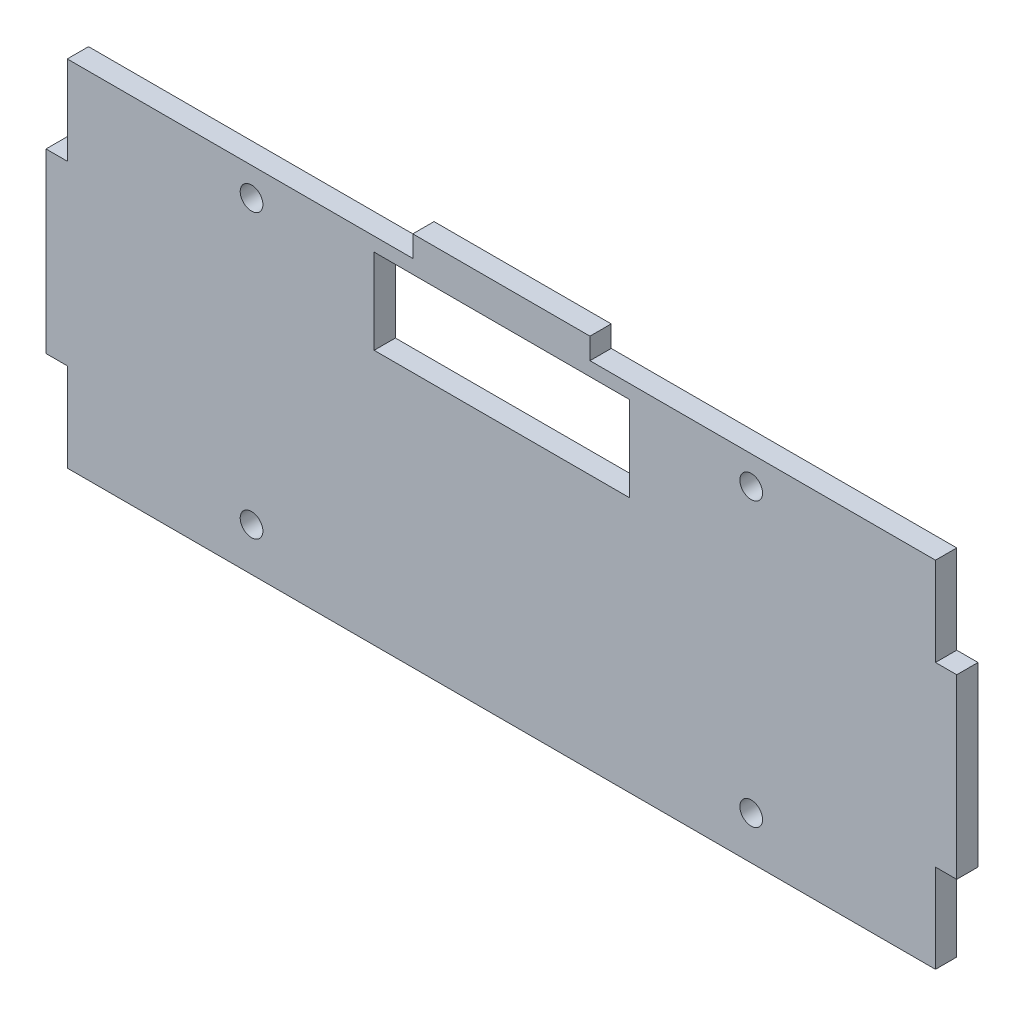
ISO-10303-21;
HEADER;
FILE_DESCRIPTION(('STEP AP214'),'2;1');
FILE_NAME('part.step','',(''),(''),'','','');
FILE_SCHEMA(('AUTOMOTIVE_DESIGN { 1 0 10303 214 1 1 1 1 }'));
ENDSEC;
DATA;
#1=APPLICATION_CONTEXT('core data for automotive mechanical design processes');
#2=APPLICATION_PROTOCOL_DEFINITION('international standard','automotive_design',2000,#1);
#3=PRODUCT_CONTEXT('',#1,'mechanical');
#4=PRODUCT('Part','Part','',(#3));
#5=PRODUCT_RELATED_PRODUCT_CATEGORY('part','',(#4));
#6=PRODUCT_DEFINITION_FORMATION('','',#4);
#7=PRODUCT_DEFINITION_CONTEXT('part definition',#1,'design');
#8=PRODUCT_DEFINITION('design','',#6,#7);
#9=PRODUCT_DEFINITION_SHAPE('','',#8);
#10=(LENGTH_UNIT() NAMED_UNIT(*) SI_UNIT(.MILLI.,.METRE.));
#11=(NAMED_UNIT(*) PLANE_ANGLE_UNIT() SI_UNIT($,.RADIAN.));
#12=(NAMED_UNIT(*) SI_UNIT($,.STERADIAN.) SOLID_ANGLE_UNIT());
#13=UNCERTAINTY_MEASURE_WITH_UNIT(LENGTH_MEASURE(1.E-05),#10,'distance_accuracy_value','');
#14=(GEOMETRIC_REPRESENTATION_CONTEXT(3) GLOBAL_UNCERTAINTY_ASSIGNED_CONTEXT((#13)) GLOBAL_UNIT_ASSIGNED_CONTEXT((#10,
#11,#12)) REPRESENTATION_CONTEXT('',''));
#15=CARTESIAN_POINT('',(0.,0.,0.));
#16=DIRECTION('',(0.,0.,1.));
#17=DIRECTION('',(1.,0.,0.));
#18=AXIS2_PLACEMENT_3D('',#15,#16,#17);
#19=CARTESIAN_POINT('',(-61.25,12.5,3.));
#20=DIRECTION('',(1.,0.,0.));
#21=DIRECTION('',(0.,0.,-1.));
#22=AXIS2_PLACEMENT_3D('',#19,#20,#21);
#23=PLANE('',#22);
#24=DIRECTION('',(0.,-1.,0.));
#25=VECTOR('',#24,1.);
#26=CARTESIAN_POINT('',(-61.25,12.5,0.));
#27=LINE('',#26,#25);
#28=CARTESIAN_POINT('',(-61.25,25.,0.));
#29=VERTEX_POINT('',#28);
#30=CARTESIAN_POINT('',(-61.25,12.5,0.));
#31=VERTEX_POINT('',#30);
#32=EDGE_CURVE('E206',#29,#31,#27,.T.);
#33=ORIENTED_EDGE('',*,*,#32,.T.);
#34=DIRECTION('',(0.,0.,-1.));
#35=VECTOR('',#34,1.);
#36=CARTESIAN_POINT('',(-61.25,12.5,3.));
#37=LINE('',#36,#35);
#38=CARTESIAN_POINT('',(-61.25,12.5,3.));
#39=VERTEX_POINT('',#38);
#40=EDGE_CURVE('E40',#39,#31,#37,.T.);
#41=ORIENTED_EDGE('',*,*,#40,.F.);
#42=DIRECTION('',(0.,-1.,0.));
#43=VECTOR('',#42,1.);
#44=CARTESIAN_POINT('',(-61.25,12.5,3.));
#45=LINE('',#44,#43);
#46=CARTESIAN_POINT('',(-61.25,25.,3.));
#47=VERTEX_POINT('',#46);
#48=EDGE_CURVE('E210',#47,#39,#45,.T.);
#49=ORIENTED_EDGE('',*,*,#48,.F.);
#50=DIRECTION('',(0.,0.,-1.));
#51=VECTOR('',#50,1.);
#52=CARTESIAN_POINT('',(-61.25,25.,3.));
#53=LINE('',#52,#51);
#54=EDGE_CURVE('E11',#47,#29,#53,.T.);
#55=ORIENTED_EDGE('',*,*,#54,.T.);
#56=EDGE_LOOP('',(#33,#41,#49,#55));
#57=FACE_BOUND('',#56,.T.);
#58=ADVANCED_FACE('F33',(#57),#23,.F.);
#59=CARTESIAN_POINT('',(-61.25,12.5,3.));
#60=DIRECTION('',(0.,-1.,0.));
#61=DIRECTION('',(1.,0.,0.));
#62=AXIS2_PLACEMENT_3D('',#59,#60,#61);
#63=PLANE('',#62);
#64=DIRECTION('',(-1.,0.,0.));
#65=VECTOR('',#64,1.);
#66=CARTESIAN_POINT('',(-61.25,12.5,0.));
#67=LINE('',#66,#65);
#68=CARTESIAN_POINT('',(-64.25,12.5,0.));
#69=VERTEX_POINT('',#68);
#70=EDGE_CURVE('E244',#31,#69,#67,.T.);
#71=ORIENTED_EDGE('',*,*,#70,.T.);
#72=DIRECTION('',(0.,0.,-1.));
#73=VECTOR('',#72,1.);
#74=CARTESIAN_POINT('',(-64.25,12.5,3.));
#75=LINE('',#74,#73);
#76=CARTESIAN_POINT('',(-64.25,12.5,3.));
#77=VERTEX_POINT('',#76);
#78=EDGE_CURVE('E313',#77,#69,#75,.T.);
#79=ORIENTED_EDGE('',*,*,#78,.F.);
#80=DIRECTION('',(-1.,0.,0.));
#81=VECTOR('',#80,1.);
#82=CARTESIAN_POINT('',(-61.25,12.5,3.));
#83=LINE('',#82,#81);
#84=EDGE_CURVE('E213',#39,#77,#83,.T.);
#85=ORIENTED_EDGE('',*,*,#84,.F.);
#86=ORIENTED_EDGE('',*,*,#40,.T.);
#87=EDGE_LOOP('',(#71,#79,#85,#86));
#88=FACE_BOUND('',#87,.T.);
#89=ADVANCED_FACE('F320',(#88),#63,.F.);
#90=CARTESIAN_POINT('',(-64.25,-12.5,3.));
#91=DIRECTION('',(1.,0.,0.));
#92=DIRECTION('',(0.,0.,-1.));
#93=AXIS2_PLACEMENT_3D('',#90,#91,#92);
#94=PLANE('',#93);
#95=DIRECTION('',(0.,-1.,0.));
#96=VECTOR('',#95,1.);
#97=CARTESIAN_POINT('',(-64.25,-12.5,0.));
#98=LINE('',#97,#96);
#99=CARTESIAN_POINT('',(-64.25,-12.5,0.));
#100=VERTEX_POINT('',#99);
#101=EDGE_CURVE('E246',#69,#100,#98,.T.);
#102=ORIENTED_EDGE('',*,*,#101,.T.);
#103=DIRECTION('',(0.,0.,-1.));
#104=VECTOR('',#103,1.);
#105=CARTESIAN_POINT('',(-64.25,-12.5,3.));
#106=LINE('',#105,#104);
#107=CARTESIAN_POINT('',(-64.25,-12.5,3.));
#108=VERTEX_POINT('',#107);
#109=EDGE_CURVE('E310',#108,#100,#106,.T.);
#110=ORIENTED_EDGE('',*,*,#109,.F.);
#111=DIRECTION('',(0.,-1.,0.));
#112=VECTOR('',#111,1.);
#113=CARTESIAN_POINT('',(-64.25,-12.5,3.));
#114=LINE('',#113,#112);
#115=EDGE_CURVE('E215',#77,#108,#114,.T.);
#116=ORIENTED_EDGE('',*,*,#115,.F.);
#117=ORIENTED_EDGE('',*,*,#78,.T.);
#118=EDGE_LOOP('',(#102,#110,#116,#117));
#119=FACE_BOUND('',#118,.T.);
#120=ADVANCED_FACE('F329',(#119),#94,.F.);
#121=CARTESIAN_POINT('',(-61.25,-12.5,3.));
#122=DIRECTION('',(0.,1.,0.));
#123=DIRECTION('',(0.,0.,1.));
#124=AXIS2_PLACEMENT_3D('',#121,#122,#123);
#125=PLANE('',#124);
#126=DIRECTION('',(1.,0.,0.));
#127=VECTOR('',#126,1.);
#128=CARTESIAN_POINT('',(-61.25,-12.5,0.));
#129=LINE('',#128,#127);
#130=CARTESIAN_POINT('',(-61.25,-12.5,0.));
#131=VERTEX_POINT('',#130);
#132=EDGE_CURVE('E248',#100,#131,#129,.T.);
#133=ORIENTED_EDGE('',*,*,#132,.T.);
#134=DIRECTION('',(0.,0.,-1.));
#135=VECTOR('',#134,1.);
#136=CARTESIAN_POINT('',(-61.25,-12.5,3.));
#137=LINE('',#136,#135);
#138=CARTESIAN_POINT('',(-61.25,-12.5,3.));
#139=VERTEX_POINT('',#138);
#140=EDGE_CURVE('E307',#139,#131,#137,.T.);
#141=ORIENTED_EDGE('',*,*,#140,.F.);
#142=DIRECTION('',(1.,0.,0.));
#143=VECTOR('',#142,1.);
#144=CARTESIAN_POINT('',(-61.25,-12.5,3.));
#145=LINE('',#144,#143);
#146=EDGE_CURVE('E217',#108,#139,#145,.T.);
#147=ORIENTED_EDGE('',*,*,#146,.F.);
#148=ORIENTED_EDGE('',*,*,#109,.T.);
#149=EDGE_LOOP('',(#133,#141,#147,#148));
#150=FACE_BOUND('',#149,.T.);
#151=ADVANCED_FACE('F333',(#150),#125,.F.);
#152=CARTESIAN_POINT('',(-61.25,-25.,3.));
#153=DIRECTION('',(1.,0.,0.));
#154=DIRECTION('',(0.,0.,-1.));
#155=AXIS2_PLACEMENT_3D('',#152,#153,#154);
#156=PLANE('',#155);
#157=DIRECTION('',(0.,-1.,0.));
#158=VECTOR('',#157,1.);
#159=CARTESIAN_POINT('',(-61.25,-25.,0.));
#160=LINE('',#159,#158);
#161=CARTESIAN_POINT('',(-61.25,-25.,0.));
#162=VERTEX_POINT('',#161);
#163=EDGE_CURVE('E250',#131,#162,#160,.T.);
#164=ORIENTED_EDGE('',*,*,#163,.T.);
#165=DIRECTION('',(0.,0.,-1.));
#166=VECTOR('',#165,1.);
#167=CARTESIAN_POINT('',(-61.25,-25.,3.));
#168=LINE('',#167,#166);
#169=CARTESIAN_POINT('',(-61.25,-25.,3.));
#170=VERTEX_POINT('',#169);
#171=EDGE_CURVE('E304',#170,#162,#168,.T.);
#172=ORIENTED_EDGE('',*,*,#171,.F.);
#173=DIRECTION('',(0.,-1.,0.));
#174=VECTOR('',#173,1.);
#175=CARTESIAN_POINT('',(-61.25,-25.,3.));
#176=LINE('',#175,#174);
#177=EDGE_CURVE('E219',#139,#170,#176,.T.);
#178=ORIENTED_EDGE('',*,*,#177,.F.);
#179=ORIENTED_EDGE('',*,*,#140,.T.);
#180=EDGE_LOOP('',(#164,#172,#178,#179));
#181=FACE_BOUND('',#180,.T.);
#182=ADVANCED_FACE('F392',(#181),#156,.F.);
#183=CARTESIAN_POINT('',(61.25,-25.,3.));
#184=DIRECTION('',(0.,1.,0.));
#185=DIRECTION('',(-1.,0.,0.));
#186=AXIS2_PLACEMENT_3D('',#183,#184,#185);
#187=PLANE('',#186);
#188=DIRECTION('',(1.,0.,0.));
#189=VECTOR('',#188,1.);
#190=CARTESIAN_POINT('',(61.25,-25.,0.));
#191=LINE('',#190,#189);
#192=CARTESIAN_POINT('',(61.25,-25.,0.));
#193=VERTEX_POINT('',#192);
#194=EDGE_CURVE('E252',#162,#193,#191,.T.);
#195=ORIENTED_EDGE('',*,*,#194,.T.);
#196=DIRECTION('',(0.,0.,-1.));
#197=VECTOR('',#196,1.);
#198=CARTESIAN_POINT('',(61.25,-25.,3.));
#199=LINE('',#198,#197);
#200=CARTESIAN_POINT('',(61.25,-25.,3.));
#201=VERTEX_POINT('',#200);
#202=EDGE_CURVE('E301',#201,#193,#199,.T.);
#203=ORIENTED_EDGE('',*,*,#202,.F.);
#204=DIRECTION('',(1.,0.,0.));
#205=VECTOR('',#204,1.);
#206=CARTESIAN_POINT('',(61.25,-25.,3.));
#207=LINE('',#206,#205);
#208=EDGE_CURVE('E221',#170,#201,#207,.T.);
#209=ORIENTED_EDGE('',*,*,#208,.F.);
#210=ORIENTED_EDGE('',*,*,#171,.T.);
#211=EDGE_LOOP('',(#195,#203,#209,#210));
#212=FACE_BOUND('',#211,.T.);
#213=ADVANCED_FACE('F390',(#212),#187,.F.);
#214=CARTESIAN_POINT('',(61.25,-25.,3.));
#215=DIRECTION('',(-1.,0.,0.));
#216=DIRECTION('',(0.,0.,1.));
#217=AXIS2_PLACEMENT_3D('',#214,#215,#216);
#218=PLANE('',#217);
#219=DIRECTION('',(0.,1.,0.));
#220=VECTOR('',#219,1.);
#221=CARTESIAN_POINT('',(61.25,-25.,0.));
#222=LINE('',#221,#220);
#223=CARTESIAN_POINT('',(61.25,-12.5,0.));
#224=VERTEX_POINT('',#223);
#225=EDGE_CURVE('E254',#193,#224,#222,.T.);
#226=ORIENTED_EDGE('',*,*,#225,.T.);
#227=DIRECTION('',(0.,0.,-1.));
#228=VECTOR('',#227,1.);
#229=CARTESIAN_POINT('',(61.25,-12.5,3.));
#230=LINE('',#229,#228);
#231=CARTESIAN_POINT('',(61.25,-12.5,3.));
#232=VERTEX_POINT('',#231);
#233=EDGE_CURVE('E298',#232,#224,#230,.T.);
#234=ORIENTED_EDGE('',*,*,#233,.F.);
#235=DIRECTION('',(0.,1.,0.));
#236=VECTOR('',#235,1.);
#237=CARTESIAN_POINT('',(61.25,-25.,3.));
#238=LINE('',#237,#236);
#239=EDGE_CURVE('E223',#201,#232,#238,.T.);
#240=ORIENTED_EDGE('',*,*,#239,.F.);
#241=ORIENTED_EDGE('',*,*,#202,.T.);
#242=EDGE_LOOP('',(#226,#234,#240,#241));
#243=FACE_BOUND('',#242,.T.);
#244=ADVANCED_FACE('F385',(#243),#218,.F.);
#245=CARTESIAN_POINT('',(61.25,-12.5,3.));
#246=DIRECTION('',(0.,1.,0.));
#247=DIRECTION('',(0.,0.,1.));
#248=AXIS2_PLACEMENT_3D('',#245,#246,#247);
#249=PLANE('',#248);
#250=DIRECTION('',(1.,0.,0.));
#251=VECTOR('',#250,1.);
#252=CARTESIAN_POINT('',(61.25,-12.5,0.));
#253=LINE('',#252,#251);
#254=CARTESIAN_POINT('',(64.25,-12.5,0.));
#255=VERTEX_POINT('',#254);
#256=EDGE_CURVE('E256',#224,#255,#253,.T.);
#257=ORIENTED_EDGE('',*,*,#256,.T.);
#258=DIRECTION('',(0.,0.,-1.));
#259=VECTOR('',#258,1.);
#260=CARTESIAN_POINT('',(64.25,-12.5,3.));
#261=LINE('',#260,#259);
#262=CARTESIAN_POINT('',(64.25,-12.5,3.));
#263=VERTEX_POINT('',#262);
#264=EDGE_CURVE('E295',#263,#255,#261,.T.);
#265=ORIENTED_EDGE('',*,*,#264,.F.);
#266=DIRECTION('',(1.,0.,0.));
#267=VECTOR('',#266,1.);
#268=CARTESIAN_POINT('',(61.25,-12.5,3.));
#269=LINE('',#268,#267);
#270=EDGE_CURVE('E225',#232,#263,#269,.T.);
#271=ORIENTED_EDGE('',*,*,#270,.F.);
#272=ORIENTED_EDGE('',*,*,#233,.T.);
#273=EDGE_LOOP('',(#257,#265,#271,#272));
#274=FACE_BOUND('',#273,.T.);
#275=ADVANCED_FACE('F380',(#274),#249,.F.);
#276=CARTESIAN_POINT('',(64.25,-12.5,3.));
#277=DIRECTION('',(-1.,0.,0.));
#278=DIRECTION('',(0.,-1.,0.));
#279=AXIS2_PLACEMENT_3D('',#276,#277,#278);
#280=PLANE('',#279);
#281=DIRECTION('',(0.,1.,0.));
#282=VECTOR('',#281,1.);
#283=CARTESIAN_POINT('',(64.25,-12.5,0.));
#284=LINE('',#283,#282);
#285=CARTESIAN_POINT('',(64.25,12.5,0.));
#286=VERTEX_POINT('',#285);
#287=EDGE_CURVE('E258',#255,#286,#284,.T.);
#288=ORIENTED_EDGE('',*,*,#287,.T.);
#289=DIRECTION('',(0.,0.,-1.));
#290=VECTOR('',#289,1.);
#291=CARTESIAN_POINT('',(64.25,12.5,3.));
#292=LINE('',#291,#290);
#293=CARTESIAN_POINT('',(64.25,12.5,3.));
#294=VERTEX_POINT('',#293);
#295=EDGE_CURVE('E292',#294,#286,#292,.T.);
#296=ORIENTED_EDGE('',*,*,#295,.F.);
#297=DIRECTION('',(0.,1.,0.));
#298=VECTOR('',#297,1.);
#299=CARTESIAN_POINT('',(64.25,-12.5,3.));
#300=LINE('',#299,#298);
#301=EDGE_CURVE('E227',#263,#294,#300,.T.);
#302=ORIENTED_EDGE('',*,*,#301,.F.);
#303=ORIENTED_EDGE('',*,*,#264,.T.);
#304=EDGE_LOOP('',(#288,#296,#302,#303));
#305=FACE_BOUND('',#304,.T.);
#306=ADVANCED_FACE('F376',(#305),#280,.F.);
#307=CARTESIAN_POINT('',(61.25,12.5,3.));
#308=DIRECTION('',(0.,-1.,0.));
#309=DIRECTION('',(1.,0.,0.));
#310=AXIS2_PLACEMENT_3D('',#307,#308,#309);
#311=PLANE('',#310);
#312=DIRECTION('',(-1.,0.,0.));
#313=VECTOR('',#312,1.);
#314=CARTESIAN_POINT('',(61.25,12.5,0.));
#315=LINE('',#314,#313);
#316=CARTESIAN_POINT('',(61.25,12.5,0.));
#317=VERTEX_POINT('',#316);
#318=EDGE_CURVE('E260',#286,#317,#315,.T.);
#319=ORIENTED_EDGE('',*,*,#318,.T.);
#320=DIRECTION('',(0.,0.,-1.));
#321=VECTOR('',#320,1.);
#322=CARTESIAN_POINT('',(61.25,12.5,3.));
#323=LINE('',#322,#321);
#324=CARTESIAN_POINT('',(61.25,12.5,3.));
#325=VERTEX_POINT('',#324);
#326=EDGE_CURVE('E289',#325,#317,#323,.T.);
#327=ORIENTED_EDGE('',*,*,#326,.F.);
#328=DIRECTION('',(-1.,0.,0.));
#329=VECTOR('',#328,1.);
#330=CARTESIAN_POINT('',(61.25,12.5,3.));
#331=LINE('',#330,#329);
#332=EDGE_CURVE('E229',#294,#325,#331,.T.);
#333=ORIENTED_EDGE('',*,*,#332,.F.);
#334=ORIENTED_EDGE('',*,*,#295,.T.);
#335=EDGE_LOOP('',(#319,#327,#333,#334));
#336=FACE_BOUND('',#335,.T.);
#337=ADVANCED_FACE('F371',(#336),#311,.F.);
#338=CARTESIAN_POINT('',(61.25,12.5,3.));
#339=DIRECTION('',(-1.,0.,0.));
#340=DIRECTION('',(0.,-1.,0.));
#341=AXIS2_PLACEMENT_3D('',#338,#339,#340);
#342=PLANE('',#341);
#343=DIRECTION('',(0.,1.,0.));
#344=VECTOR('',#343,1.);
#345=CARTESIAN_POINT('',(61.25,12.5,0.));
#346=LINE('',#345,#344);
#347=CARTESIAN_POINT('',(61.25,25.,0.));
#348=VERTEX_POINT('',#347);
#349=EDGE_CURVE('E262',#317,#348,#346,.T.);
#350=ORIENTED_EDGE('',*,*,#349,.T.);
#351=DIRECTION('',(0.,0.,-1.));
#352=VECTOR('',#351,1.);
#353=CARTESIAN_POINT('',(61.25,25.,3.));
#354=LINE('',#353,#352);
#355=CARTESIAN_POINT('',(61.25,25.,3.));
#356=VERTEX_POINT('',#355);
#357=EDGE_CURVE('E286',#356,#348,#354,.T.);
#358=ORIENTED_EDGE('',*,*,#357,.F.);
#359=DIRECTION('',(0.,1.,0.));
#360=VECTOR('',#359,1.);
#361=CARTESIAN_POINT('',(61.25,12.5,3.));
#362=LINE('',#361,#360);
#363=EDGE_CURVE('E231',#325,#356,#362,.T.);
#364=ORIENTED_EDGE('',*,*,#363,.F.);
#365=ORIENTED_EDGE('',*,*,#326,.T.);
#366=EDGE_LOOP('',(#350,#358,#364,#365));
#367=FACE_BOUND('',#366,.T.);
#368=ADVANCED_FACE('F365',(#367),#342,.F.);
#369=CARTESIAN_POINT('',(26.65,25.,3.));
#370=DIRECTION('',(0.,-1.,0.));
#371=DIRECTION('',(0.,0.,-1.));
#372=AXIS2_PLACEMENT_3D('',#369,#370,#371);
#373=PLANE('',#372);
#374=DIRECTION('',(-1.,0.,0.));
#375=VECTOR('',#374,1.);
#376=CARTESIAN_POINT('',(26.65,25.,0.));
#377=LINE('',#376,#375);
#378=CARTESIAN_POINT('',(12.5,25.,0.));
#379=VERTEX_POINT('',#378);
#380=EDGE_CURVE('E265',#348,#379,#377,.T.);
#381=ORIENTED_EDGE('',*,*,#380,.T.);
#382=DIRECTION('',(0.,0.,-1.));
#383=VECTOR('',#382,1.);
#384=CARTESIAN_POINT('',(12.5,25.,3.));
#385=LINE('',#384,#383);
#386=CARTESIAN_POINT('',(12.5,25.,3.));
#387=VERTEX_POINT('',#386);
#388=EDGE_CURVE('E283',#387,#379,#385,.T.);
#389=ORIENTED_EDGE('',*,*,#388,.F.);
#390=DIRECTION('',(-1.,0.,0.));
#391=VECTOR('',#390,1.);
#392=CARTESIAN_POINT('',(61.25,25.,3.));
#393=LINE('',#392,#391);
#394=EDGE_CURVE('E233',#356,#387,#393,.T.);
#395=ORIENTED_EDGE('',*,*,#394,.F.);
#396=ORIENTED_EDGE('',*,*,#357,.T.);
#397=EDGE_LOOP('',(#381,#389,#395,#396));
#398=FACE_BOUND('',#397,.T.);
#399=ADVANCED_FACE('F361',(#398),#373,.F.);
#400=CARTESIAN_POINT('',(12.5,25.,3.));
#401=DIRECTION('',(-1.,0.,0.));
#402=DIRECTION('',(0.,0.,1.));
#403=AXIS2_PLACEMENT_3D('',#400,#401,#402);
#404=PLANE('',#403);
#405=DIRECTION('',(0.,1.,0.));
#406=VECTOR('',#405,1.);
#407=CARTESIAN_POINT('',(12.5,25.,0.));
#408=LINE('',#407,#406);
#409=CARTESIAN_POINT('',(12.5,28.,0.));
#410=VERTEX_POINT('',#409);
#411=EDGE_CURVE('E267',#379,#410,#408,.T.);
#412=ORIENTED_EDGE('',*,*,#411,.T.);
#413=DIRECTION('',(0.,0.,-1.));
#414=VECTOR('',#413,1.);
#415=CARTESIAN_POINT('',(12.5,28.,3.));
#416=LINE('',#415,#414);
#417=CARTESIAN_POINT('',(12.5,28.,3.));
#418=VERTEX_POINT('',#417);
#419=EDGE_CURVE('E280',#418,#410,#416,.T.);
#420=ORIENTED_EDGE('',*,*,#419,.F.);
#421=DIRECTION('',(0.,1.,0.));
#422=VECTOR('',#421,1.);
#423=CARTESIAN_POINT('',(12.5,25.,3.));
#424=LINE('',#423,#422);
#425=EDGE_CURVE('E235',#387,#418,#424,.T.);
#426=ORIENTED_EDGE('',*,*,#425,.F.);
#427=ORIENTED_EDGE('',*,*,#388,.T.);
#428=EDGE_LOOP('',(#412,#420,#426,#427));
#429=FACE_BOUND('',#428,.T.);
#430=ADVANCED_FACE('F356',(#429),#404,.F.);
#431=CARTESIAN_POINT('',(-12.5,28.,3.));
#432=DIRECTION('',(0.,-1.,0.));
#433=DIRECTION('',(1.,0.,0.));
#434=AXIS2_PLACEMENT_3D('',#431,#432,#433);
#435=PLANE('',#434);
#436=DIRECTION('',(-1.,0.,0.));
#437=VECTOR('',#436,1.);
#438=CARTESIAN_POINT('',(-12.5,28.,0.));
#439=LINE('',#438,#437);
#440=CARTESIAN_POINT('',(-12.5,28.,0.));
#441=VERTEX_POINT('',#440);
#442=EDGE_CURVE('E269',#410,#441,#439,.T.);
#443=ORIENTED_EDGE('',*,*,#442,.T.);
#444=DIRECTION('',(0.,0.,-1.));
#445=VECTOR('',#444,1.);
#446=CARTESIAN_POINT('',(-12.5,28.,3.));
#447=LINE('',#446,#445);
#448=CARTESIAN_POINT('',(-12.5,28.,3.));
#449=VERTEX_POINT('',#448);
#450=EDGE_CURVE('E277',#449,#441,#447,.T.);
#451=ORIENTED_EDGE('',*,*,#450,.F.);
#452=DIRECTION('',(-1.,0.,0.));
#453=VECTOR('',#452,1.);
#454=CARTESIAN_POINT('',(-12.5,28.,3.));
#455=LINE('',#454,#453);
#456=EDGE_CURVE('E237',#418,#449,#455,.T.);
#457=ORIENTED_EDGE('',*,*,#456,.F.);
#458=ORIENTED_EDGE('',*,*,#419,.T.);
#459=EDGE_LOOP('',(#443,#451,#457,#458));
#460=FACE_BOUND('',#459,.T.);
#461=ADVANCED_FACE('F351',(#460),#435,.F.);
#462=CARTESIAN_POINT('',(-12.5,25.,3.));
#463=DIRECTION('',(1.,0.,0.));
#464=DIRECTION('',(0.,0.,-1.));
#465=AXIS2_PLACEMENT_3D('',#462,#463,#464);
#466=PLANE('',#465);
#467=DIRECTION('',(0.,-1.,0.));
#468=VECTOR('',#467,1.);
#469=CARTESIAN_POINT('',(-12.5,25.,0.));
#470=LINE('',#469,#468);
#471=CARTESIAN_POINT('',(-12.5,25.,0.));
#472=VERTEX_POINT('',#471);
#473=EDGE_CURVE('E271',#441,#472,#470,.T.);
#474=ORIENTED_EDGE('',*,*,#473,.T.);
#475=DIRECTION('',(0.,0.,-1.));
#476=VECTOR('',#475,1.);
#477=CARTESIAN_POINT('',(-12.5,25.,3.));
#478=LINE('',#477,#476);
#479=CARTESIAN_POINT('',(-12.5,25.,3.));
#480=VERTEX_POINT('',#479);
#481=EDGE_CURVE('E242',#480,#472,#478,.T.);
#482=ORIENTED_EDGE('',*,*,#481,.F.);
#483=DIRECTION('',(0.,-1.,0.));
#484=VECTOR('',#483,1.);
#485=CARTESIAN_POINT('',(-12.5,25.,3.));
#486=LINE('',#485,#484);
#487=EDGE_CURVE('E239',#449,#480,#486,.T.);
#488=ORIENTED_EDGE('',*,*,#487,.F.);
#489=ORIENTED_EDGE('',*,*,#450,.T.);
#490=EDGE_LOOP('',(#474,#482,#488,#489));
#491=FACE_BOUND('',#490,.T.);
#492=ADVANCED_FACE('F346',(#491),#466,.F.);
#493=CARTESIAN_POINT('',(-29.85,25.,3.));
#494=DIRECTION('',(0.,-1.,0.));
#495=DIRECTION('',(1.,0.,0.));
#496=AXIS2_PLACEMENT_3D('',#493,#494,#495);
#497=PLANE('',#496);
#498=DIRECTION('',(-1.,0.,0.));
#499=VECTOR('',#498,1.);
#500=CARTESIAN_POINT('',(-29.85,25.,0.));
#501=LINE('',#500,#499);
#502=EDGE_CURVE('E211',#472,#29,#501,.T.);
#503=ORIENTED_EDGE('',*,*,#502,.T.);
#504=ORIENTED_EDGE('',*,*,#54,.F.);
#505=DIRECTION('',(-1.,0.,0.));
#506=VECTOR('',#505,1.);
#507=CARTESIAN_POINT('',(-29.85,25.,3.));
#508=LINE('',#507,#506);
#509=EDGE_CURVE('E207',#480,#47,#508,.T.);
#510=ORIENTED_EDGE('',*,*,#509,.F.);
#511=ORIENTED_EDGE('',*,*,#481,.T.);
#512=EDGE_LOOP('',(#503,#504,#510,#511));
#513=FACE_BOUND('',#512,.T.);
#514=ADVANCED_FACE('F341',(#513),#497,.F.);
#515=CARTESIAN_POINT('',(0.,0.,3.));
#516=DIRECTION('',(0.,0.,-1.));
#517=DIRECTION('',(-1.,0.,0.));
#518=AXIS2_PLACEMENT_3D('',#515,#516,#517);
#519=PLANE('',#518);
#520=CARTESIAN_POINT('',(-35.25,-18.9,3.));
#521=DIRECTION('',(0.,0.,1.));
#522=DIRECTION('',(1.,0.,0.));
#523=AXIS2_PLACEMENT_3D('',#520,#521,#522);
#524=CIRCLE('',#523,1.6000000000004);
#525=CARTESIAN_POINT('',(-33.6499999999996,-18.9,3.));
#526=VERTEX_POINT('',#525);
#527=EDGE_CURVE('E612',#526,#526,#524,.T.);
#528=ORIENTED_EDGE('',*,*,#527,.F.);
#529=EDGE_LOOP('',(#528));
#530=FACE_BOUND('',#529,.T.);
#531=CARTESIAN_POINT('',(35.2500000000002,-18.9,3.));
#532=DIRECTION('',(0.,0.,1.));
#533=DIRECTION('',(1.,0.,0.));
#534=AXIS2_PLACEMENT_3D('',#531,#532,#533);
#535=CIRCLE('',#534,1.6);
#536=CARTESIAN_POINT('',(36.8500000000002,-18.9,3.));
#537=VERTEX_POINT('',#536);
#538=EDGE_CURVE('E618',#537,#537,#535,.T.);
#539=ORIENTED_EDGE('',*,*,#538,.F.);
#540=EDGE_LOOP('',(#539));
#541=FACE_BOUND('',#540,.T.);
#542=CARTESIAN_POINT('',(-35.2500000000001,21.,3.));
#543=DIRECTION('',(0.,0.,1.));
#544=DIRECTION('',(1.,0.,0.));
#545=AXIS2_PLACEMENT_3D('',#542,#543,#544);
#546=CIRCLE('',#545,1.6);
#547=CARTESIAN_POINT('',(-33.6500000000001,21.,3.));
#548=VERTEX_POINT('',#547);
#549=EDGE_CURVE('E615',#548,#548,#546,.T.);
#550=ORIENTED_EDGE('',*,*,#549,.F.);
#551=EDGE_LOOP('',(#550));
#552=FACE_BOUND('',#551,.T.);
#553=CARTESIAN_POINT('',(35.2499999999999,21.,3.));
#554=DIRECTION('',(0.,0.,1.));
#555=DIRECTION('',(1.,0.,0.));
#556=AXIS2_PLACEMENT_3D('',#553,#554,#555);
#557=CIRCLE('',#556,1.6);
#558=CARTESIAN_POINT('',(36.8499999999999,21.,3.));
#559=VERTEX_POINT('',#558);
#560=EDGE_CURVE('E626',#559,#559,#557,.T.);
#561=ORIENTED_EDGE('',*,*,#560,.F.);
#562=EDGE_LOOP('',(#561));
#563=FACE_BOUND('',#562,.T.);
#564=DIRECTION('',(-1.,0.,0.));
#565=VECTOR('',#564,1.);
#566=CARTESIAN_POINT('',(0.,11.0436456315182,3.));
#567=LINE('',#566,#565);
#568=CARTESIAN_POINT('',(18.0476885225086,11.0436456315182,3.));
#569=VERTEX_POINT('',#568);
#570=CARTESIAN_POINT('',(-17.9523114774914,11.0436456315182,3.));
#571=VERTEX_POINT('',#570);
#572=EDGE_CURVE('E200',#569,#571,#567,.T.);
#573=ORIENTED_EDGE('',*,*,#572,.T.);
#574=DIRECTION('',(0.,1.,0.));
#575=VECTOR('',#574,1.);
#576=CARTESIAN_POINT('',(-17.9523114774914,0.,3.));
#577=LINE('',#576,#575);
#578=CARTESIAN_POINT('',(-17.9523114774914,23.0436456315182,3.));
#579=VERTEX_POINT('',#578);
#580=EDGE_CURVE('E203',#571,#579,#577,.T.);
#581=ORIENTED_EDGE('',*,*,#580,.T.);
#582=DIRECTION('',(1.,0.,0.));
#583=VECTOR('',#582,1.);
#584=CARTESIAN_POINT('',(0.,23.0436456315182,3.));
#585=LINE('',#584,#583);
#586=CARTESIAN_POINT('',(18.0476885225086,23.0436456315182,3.));
#587=VERTEX_POINT('',#586);
#588=EDGE_CURVE('E195',#579,#587,#585,.T.);
#589=ORIENTED_EDGE('',*,*,#588,.T.);
#590=DIRECTION('',(0.,-1.,0.));
#591=VECTOR('',#590,1.);
#592=CARTESIAN_POINT('',(18.0476885225086,0.,3.));
#593=LINE('',#592,#591);
#594=EDGE_CURVE('E175',#587,#569,#593,.T.);
#595=ORIENTED_EDGE('',*,*,#594,.T.);
#596=EDGE_LOOP('',(#573,#581,#589,#595));
#597=FACE_BOUND('',#596,.T.);
#598=ORIENTED_EDGE('',*,*,#509,.T.);
#599=ORIENTED_EDGE('',*,*,#48,.T.);
#600=ORIENTED_EDGE('',*,*,#84,.T.);
#601=ORIENTED_EDGE('',*,*,#115,.T.);
#602=ORIENTED_EDGE('',*,*,#146,.T.);
#603=ORIENTED_EDGE('',*,*,#177,.T.);
#604=ORIENTED_EDGE('',*,*,#208,.T.);
#605=ORIENTED_EDGE('',*,*,#239,.T.);
#606=ORIENTED_EDGE('',*,*,#270,.T.);
#607=ORIENTED_EDGE('',*,*,#301,.T.);
#608=ORIENTED_EDGE('',*,*,#332,.T.);
#609=ORIENTED_EDGE('',*,*,#363,.T.);
#610=ORIENTED_EDGE('',*,*,#394,.T.);
#611=ORIENTED_EDGE('',*,*,#425,.T.);
#612=ORIENTED_EDGE('',*,*,#456,.T.);
#613=ORIENTED_EDGE('',*,*,#487,.T.);
#614=EDGE_LOOP('',(#598,#599,#600,#601,#602,#603,#604,#605,#606,#607,#608,#609,#610,#611,#612,#613));
#615=FACE_BOUND('',#614,.T.);
#616=ADVANCED_FACE('F337',(#530,#541,#552,#563,#597,#615),#519,.F.);
#617=CARTESIAN_POINT('',(0.,0.,0.));
#618=DIRECTION('',(0.,0.,-1.));
#619=DIRECTION('',(-1.,0.,0.));
#620=AXIS2_PLACEMENT_3D('',#617,#618,#619);
#621=PLANE('',#620);
#622=CARTESIAN_POINT('',(-35.25,-18.9,0.));
#623=DIRECTION('',(0.,0.,1.));
#624=DIRECTION('',(1.,0.,0.));
#625=AXIS2_PLACEMENT_3D('',#622,#623,#624);
#626=CIRCLE('',#625,1.6000000000004);
#627=CARTESIAN_POINT('',(-33.6499999999996,-18.9,0.));
#628=VERTEX_POINT('',#627);
#629=EDGE_CURVE('E609',#628,#628,#626,.T.);
#630=ORIENTED_EDGE('',*,*,#629,.T.);
#631=EDGE_LOOP('',(#630));
#632=FACE_BOUND('',#631,.T.);
#633=CARTESIAN_POINT('',(35.2500000000002,-18.9,0.));
#634=DIRECTION('',(0.,0.,1.));
#635=DIRECTION('',(1.,0.,0.));
#636=AXIS2_PLACEMENT_3D('',#633,#634,#635);
#637=CIRCLE('',#636,1.6);
#638=CARTESIAN_POINT('',(36.8500000000002,-18.9,0.));
#639=VERTEX_POINT('',#638);
#640=EDGE_CURVE('E613',#639,#639,#637,.T.);
#641=ORIENTED_EDGE('',*,*,#640,.T.);
#642=EDGE_LOOP('',(#641));
#643=FACE_BOUND('',#642,.T.);
#644=CARTESIAN_POINT('',(-35.2500000000001,21.,0.));
#645=DIRECTION('',(0.,0.,1.));
#646=DIRECTION('',(1.,0.,0.));
#647=AXIS2_PLACEMENT_3D('',#644,#645,#646);
#648=CIRCLE('',#647,1.6);
#649=CARTESIAN_POINT('',(-33.6500000000001,21.,0.));
#650=VERTEX_POINT('',#649);
#651=EDGE_CURVE('E623',#650,#650,#648,.T.);
#652=ORIENTED_EDGE('',*,*,#651,.T.);
#653=EDGE_LOOP('',(#652));
#654=FACE_BOUND('',#653,.T.);
#655=CARTESIAN_POINT('',(35.2499999999999,21.,0.));
#656=DIRECTION('',(0.,0.,1.));
#657=DIRECTION('',(1.,0.,0.));
#658=AXIS2_PLACEMENT_3D('',#655,#656,#657);
#659=CIRCLE('',#658,1.6);
#660=CARTESIAN_POINT('',(36.8499999999999,21.,0.));
#661=VERTEX_POINT('',#660);
#662=EDGE_CURVE('E629',#661,#661,#659,.T.);
#663=ORIENTED_EDGE('',*,*,#662,.T.);
#664=EDGE_LOOP('',(#663));
#665=FACE_BOUND('',#664,.T.);
#666=DIRECTION('',(0.,1.,0.));
#667=VECTOR('',#666,1.);
#668=CARTESIAN_POINT('',(-17.9523114774914,23.0436456315182,0.));
#669=LINE('',#668,#667);
#670=CARTESIAN_POINT('',(-17.9523114774914,11.0436456315182,0.));
#671=VERTEX_POINT('',#670);
#672=CARTESIAN_POINT('',(-17.9523114774914,23.0436456315182,0.));
#673=VERTEX_POINT('',#672);
#674=EDGE_CURVE('E55',#671,#673,#669,.T.);
#675=ORIENTED_EDGE('',*,*,#674,.F.);
#676=DIRECTION('',(-1.,0.,0.));
#677=VECTOR('',#676,1.);
#678=CARTESIAN_POINT('',(18.0476885225086,11.0436456315182,0.));
#679=LINE('',#678,#677);
#680=CARTESIAN_POINT('',(18.0476885225086,11.0436456315182,0.));
#681=VERTEX_POINT('',#680);
#682=EDGE_CURVE('E188',#681,#671,#679,.T.);
#683=ORIENTED_EDGE('',*,*,#682,.F.);
#684=DIRECTION('',(0.,-1.,0.));
#685=VECTOR('',#684,1.);
#686=CARTESIAN_POINT('',(18.0476885225086,23.0436456315182,0.));
#687=LINE('',#686,#685);
#688=CARTESIAN_POINT('',(18.0476885225086,23.0436456315182,0.));
#689=VERTEX_POINT('',#688);
#690=EDGE_CURVE('E172',#689,#681,#687,.T.);
#691=ORIENTED_EDGE('',*,*,#690,.F.);
#692=DIRECTION('',(1.,0.,0.));
#693=VECTOR('',#692,1.);
#694=CARTESIAN_POINT('',(18.0476885225086,23.0436456315182,0.));
#695=LINE('',#694,#693);
#696=EDGE_CURVE('E181',#673,#689,#695,.T.);
#697=ORIENTED_EDGE('',*,*,#696,.F.);
#698=EDGE_LOOP('',(#675,#683,#691,#697));
#699=FACE_BOUND('',#698,.T.);
#700=ORIENTED_EDGE('',*,*,#32,.F.);
#701=ORIENTED_EDGE('',*,*,#502,.F.);
#702=ORIENTED_EDGE('',*,*,#473,.F.);
#703=ORIENTED_EDGE('',*,*,#442,.F.);
#704=ORIENTED_EDGE('',*,*,#411,.F.);
#705=ORIENTED_EDGE('',*,*,#380,.F.);
#706=ORIENTED_EDGE('',*,*,#349,.F.);
#707=ORIENTED_EDGE('',*,*,#318,.F.);
#708=ORIENTED_EDGE('',*,*,#287,.F.);
#709=ORIENTED_EDGE('',*,*,#256,.F.);
#710=ORIENTED_EDGE('',*,*,#225,.F.);
#711=ORIENTED_EDGE('',*,*,#194,.F.);
#712=ORIENTED_EDGE('',*,*,#163,.F.);
#713=ORIENTED_EDGE('',*,*,#132,.F.);
#714=ORIENTED_EDGE('',*,*,#101,.F.);
#715=ORIENTED_EDGE('',*,*,#70,.F.);
#716=EDGE_LOOP('',(#700,#701,#702,#703,#704,#705,#706,#707,#708,#709,#710,#711,#712,#713,#714,#715));
#717=FACE_BOUND('',#716,.T.);
#718=ADVANCED_FACE('F185',(#632,#643,#654,#665,#699,#717),#621,.T.);
#719=CARTESIAN_POINT('',(-17.9523114774914,23.0436456315182,4.));
#720=DIRECTION('',(-1.,0.,0.));
#721=DIRECTION('',(0.,-1.,0.));
#722=AXIS2_PLACEMENT_3D('',#719,#720,#721);
#723=PLANE('',#722);
#724=DIRECTION('',(0.,0.,-1.));
#725=VECTOR('',#724,1.);
#726=CARTESIAN_POINT('',(-17.9523114774914,11.0436456315182,4.));
#727=LINE('',#726,#725);
#728=EDGE_CURVE('E193',#571,#671,#727,.T.);
#729=ORIENTED_EDGE('',*,*,#728,.T.);
#730=ORIENTED_EDGE('',*,*,#674,.T.);
#731=DIRECTION('',(0.,0.,-1.));
#732=VECTOR('',#731,1.);
#733=CARTESIAN_POINT('',(-17.9523114774914,23.0436456315182,4.));
#734=LINE('',#733,#732);
#735=EDGE_CURVE('E178',#579,#673,#734,.T.);
#736=ORIENTED_EDGE('',*,*,#735,.F.);
#737=ORIENTED_EDGE('',*,*,#580,.F.);
#738=EDGE_LOOP('',(#729,#730,#736,#737));
#739=FACE_BOUND('',#738,.T.);
#740=ADVANCED_FACE('F516',(#739),#723,.F.);
#741=CARTESIAN_POINT('',(18.0476885225086,11.0436456315182,4.));
#742=DIRECTION('',(0.,-1.,0.));
#743=DIRECTION('',(0.,0.,-1.));
#744=AXIS2_PLACEMENT_3D('',#741,#742,#743);
#745=PLANE('',#744);
#746=DIRECTION('',(0.,0.,-1.));
#747=VECTOR('',#746,1.);
#748=CARTESIAN_POINT('',(18.0476885225086,11.0436456315182,4.));
#749=LINE('',#748,#747);
#750=EDGE_CURVE('E177',#569,#681,#749,.T.);
#751=ORIENTED_EDGE('',*,*,#750,.T.);
#752=ORIENTED_EDGE('',*,*,#682,.T.);
#753=ORIENTED_EDGE('',*,*,#728,.F.);
#754=ORIENTED_EDGE('',*,*,#572,.F.);
#755=EDGE_LOOP('',(#751,#752,#753,#754));
#756=FACE_BOUND('',#755,.T.);
#757=ADVANCED_FACE('F521',(#756),#745,.F.);
#758=CARTESIAN_POINT('',(18.0476885225086,23.0436456315182,4.));
#759=DIRECTION('',(1.,0.,0.));
#760=DIRECTION('',(0.,1.,0.));
#761=AXIS2_PLACEMENT_3D('',#758,#759,#760);
#762=PLANE('',#761);
#763=DIRECTION('',(0.,0.,-1.));
#764=VECTOR('',#763,1.);
#765=CARTESIAN_POINT('',(18.0476885225086,23.0436456315182,4.));
#766=LINE('',#765,#764);
#767=EDGE_CURVE('E47',#587,#689,#766,.T.);
#768=ORIENTED_EDGE('',*,*,#767,.T.);
#769=ORIENTED_EDGE('',*,*,#690,.T.);
#770=ORIENTED_EDGE('',*,*,#750,.F.);
#771=ORIENTED_EDGE('',*,*,#594,.F.);
#772=EDGE_LOOP('',(#768,#769,#770,#771));
#773=FACE_BOUND('',#772,.T.);
#774=ADVANCED_FACE('F169',(#773),#762,.F.);
#775=CARTESIAN_POINT('',(18.0476885225086,23.0436456315182,4.));
#776=DIRECTION('',(0.,1.,0.));
#777=DIRECTION('',(0.,0.,1.));
#778=AXIS2_PLACEMENT_3D('',#775,#776,#777);
#779=PLANE('',#778);
#780=ORIENTED_EDGE('',*,*,#735,.T.);
#781=ORIENTED_EDGE('',*,*,#696,.T.);
#782=ORIENTED_EDGE('',*,*,#767,.F.);
#783=ORIENTED_EDGE('',*,*,#588,.F.);
#784=EDGE_LOOP('',(#780,#781,#782,#783));
#785=FACE_BOUND('',#784,.T.);
#786=ADVANCED_FACE('F182',(#785),#779,.F.);
#787=CARTESIAN_POINT('',(35.2499999999999,21.,0.));
#788=DIRECTION('',(0.,0.,1.));
#789=DIRECTION('',(1.,0.,0.));
#790=AXIS2_PLACEMENT_3D('',#787,#788,#789);
#791=CYLINDRICAL_SURFACE('',#790,1.6);
#792=ORIENTED_EDGE('',*,*,#662,.F.);
#793=EDGE_LOOP('',(#792));
#794=FACE_BOUND('',#793,.T.);
#795=ORIENTED_EDGE('',*,*,#560,.T.);
#796=EDGE_LOOP('',(#795));
#797=FACE_BOUND('',#796,.T.);
#798=ADVANCED_FACE('F549',(#794,#797),#791,.F.);
#799=CARTESIAN_POINT('',(-35.2500000000001,21.,0.));
#800=DIRECTION('',(0.,0.,1.));
#801=DIRECTION('',(1.,0.,0.));
#802=AXIS2_PLACEMENT_3D('',#799,#800,#801);
#803=CYLINDRICAL_SURFACE('',#802,1.6);
#804=ORIENTED_EDGE('',*,*,#651,.F.);
#805=EDGE_LOOP('',(#804));
#806=FACE_BOUND('',#805,.T.);
#807=ORIENTED_EDGE('',*,*,#549,.T.);
#808=EDGE_LOOP('',(#807));
#809=FACE_BOUND('',#808,.T.);
#810=ADVANCED_FACE('F558',(#806,#809),#803,.F.);
#811=CARTESIAN_POINT('',(35.2500000000002,-18.9,0.));
#812=DIRECTION('',(0.,0.,1.));
#813=DIRECTION('',(1.,0.,0.));
#814=AXIS2_PLACEMENT_3D('',#811,#812,#813);
#815=CYLINDRICAL_SURFACE('',#814,1.6);
#816=ORIENTED_EDGE('',*,*,#640,.F.);
#817=EDGE_LOOP('',(#816));
#818=FACE_BOUND('',#817,.T.);
#819=ORIENTED_EDGE('',*,*,#538,.T.);
#820=EDGE_LOOP('',(#819));
#821=FACE_BOUND('',#820,.T.);
#822=ADVANCED_FACE('F568',(#818,#821),#815,.F.);
#823=CARTESIAN_POINT('',(-35.25,-18.9,0.));
#824=DIRECTION('',(0.,0.,1.));
#825=DIRECTION('',(1.,0.,0.));
#826=AXIS2_PLACEMENT_3D('',#823,#824,#825);
#827=CYLINDRICAL_SURFACE('',#826,1.6000000000004);
#828=ORIENTED_EDGE('',*,*,#629,.F.);
#829=EDGE_LOOP('',(#828));
#830=FACE_BOUND('',#829,.T.);
#831=ORIENTED_EDGE('',*,*,#527,.T.);
#832=EDGE_LOOP('',(#831));
#833=FACE_BOUND('',#832,.T.);
#834=ADVANCED_FACE('F592',(#830,#833),#827,.F.);
#835=CLOSED_SHELL('',(#58,#89,#120,#151,#182,#213,#244,#275,#306,#337,#368,#399,#430,#461,#492,
#514,#616,#718,#740,#757,#774,#786,#798,#810,#822,#834));
#836=MANIFOLD_SOLID_BREP('B2',#835);
#837=ADVANCED_BREP_SHAPE_REPRESENTATION('',(#18,#836),#14);
#838=SHAPE_DEFINITION_REPRESENTATION(#9,#837);
ENDSEC;
END-ISO-10303-21;
